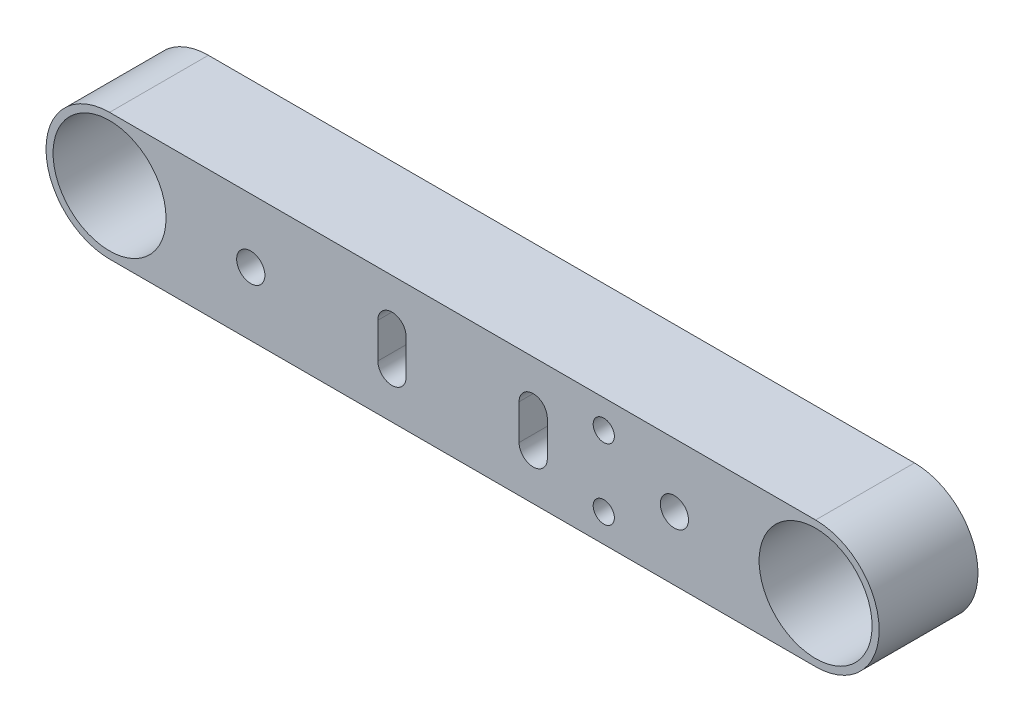
ISO-10303-21;
HEADER;
FILE_DESCRIPTION(('STEP AP214'),'2;1');
FILE_NAME('part.step','',(''),(''),'','','');
FILE_SCHEMA(('AUTOMOTIVE_DESIGN { 1 0 10303 214 1 1 1 1 }'));
ENDSEC;
DATA;
#1=APPLICATION_CONTEXT('core data for automotive mechanical design processes');
#2=APPLICATION_PROTOCOL_DEFINITION('international standard','automotive_design',2000,#1);
#3=PRODUCT_CONTEXT('',#1,'mechanical');
#4=PRODUCT('Part','Part','',(#3));
#5=PRODUCT_RELATED_PRODUCT_CATEGORY('part','',(#4));
#6=PRODUCT_DEFINITION_FORMATION('','',#4);
#7=PRODUCT_DEFINITION_CONTEXT('part definition',#1,'design');
#8=PRODUCT_DEFINITION('design','',#6,#7);
#9=PRODUCT_DEFINITION_SHAPE('','',#8);
#10=(LENGTH_UNIT() NAMED_UNIT(*) SI_UNIT(.MILLI.,.METRE.));
#11=(NAMED_UNIT(*) PLANE_ANGLE_UNIT() SI_UNIT($,.RADIAN.));
#12=(NAMED_UNIT(*) SI_UNIT($,.STERADIAN.) SOLID_ANGLE_UNIT());
#13=UNCERTAINTY_MEASURE_WITH_UNIT(LENGTH_MEASURE(1.E-05),#10,'distance_accuracy_value','');
#14=(GEOMETRIC_REPRESENTATION_CONTEXT(3) GLOBAL_UNCERTAINTY_ASSIGNED_CONTEXT((#13)) GLOBAL_UNIT_ASSIGNED_CONTEXT((#10,
#11,#12)) REPRESENTATION_CONTEXT('',''));
#15=CARTESIAN_POINT('',(0.,0.,0.));
#16=DIRECTION('',(0.,0.,1.));
#17=DIRECTION('',(1.,0.,0.));
#18=AXIS2_PLACEMENT_3D('',#15,#16,#17);
#19=CARTESIAN_POINT('',(-50.,0.,7.));
#20=DIRECTION('',(0.,0.,1.));
#21=DIRECTION('',(1.,0.,0.));
#22=AXIS2_PLACEMENT_3D('',#19,#20,#21);
#23=PLANE('',#22);
#24=DIRECTION('',(0.,1.,0.));
#25=VECTOR('',#24,1.);
#26=CARTESIAN_POINT('',(12.,-2.50000000000001,7.));
#27=LINE('',#26,#25);
#28=CARTESIAN_POINT('',(12.,-2.50000000000001,7.));
#29=VERTEX_POINT('',#28);
#30=CARTESIAN_POINT('',(12.,2.49999999999999,7.));
#31=VERTEX_POINT('',#30);
#32=EDGE_CURVE('E138',#29,#31,#27,.T.);
#33=ORIENTED_EDGE('',*,*,#32,.F.);
#34=CARTESIAN_POINT('',(10.,-2.50000000000001,7.));
#35=DIRECTION('',(0.,0.,1.));
#36=DIRECTION('',(-1.,0.,0.));
#37=AXIS2_PLACEMENT_3D('',#34,#35,#36);
#38=CIRCLE('',#37,2.);
#39=CARTESIAN_POINT('',(8.,-2.50000000000001,7.));
#40=VERTEX_POINT('',#39);
#41=EDGE_CURVE('E130',#40,#29,#38,.T.);
#42=ORIENTED_EDGE('',*,*,#41,.F.);
#43=DIRECTION('',(0.,-1.,0.));
#44=VECTOR('',#43,1.);
#45=CARTESIAN_POINT('',(8.,-2.50000000000001,7.));
#46=LINE('',#45,#44);
#47=CARTESIAN_POINT('',(8.00000000000001,2.49999999999999,7.));
#48=VERTEX_POINT('',#47);
#49=EDGE_CURVE('E153',#48,#40,#46,.T.);
#50=ORIENTED_EDGE('',*,*,#49,.F.);
#51=CARTESIAN_POINT('',(10.,2.49999999999999,7.));
#52=DIRECTION('',(0.,0.,1.));
#53=DIRECTION('',(-1.,0.,0.));
#54=AXIS2_PLACEMENT_3D('',#51,#52,#53);
#55=CIRCLE('',#54,2.);
#56=EDGE_CURVE('E151',#31,#48,#55,.T.);
#57=ORIENTED_EDGE('',*,*,#56,.F.);
#58=EDGE_LOOP('',(#33,#42,#50,#57));
#59=FACE_BOUND('',#58,.T.);
#60=CARTESIAN_POINT('',(20.,5.,7.));
#61=DIRECTION('',(0.,0.,1.));
#62=DIRECTION('',(1.,0.,0.));
#63=AXIS2_PLACEMENT_3D('',#60,#61,#62);
#64=CIRCLE('',#63,1.49999999999998);
#65=CARTESIAN_POINT('',(21.5,5.,7.));
#66=VERTEX_POINT('',#65);
#67=EDGE_CURVE('E169',#66,#66,#64,.T.);
#68=ORIENTED_EDGE('',*,*,#67,.F.);
#69=EDGE_LOOP('',(#68));
#70=FACE_BOUND('',#69,.T.);
#71=CARTESIAN_POINT('',(-50.,0.,7.));
#72=DIRECTION('',(0.,0.,1.));
#73=DIRECTION('',(1.,0.,0.));
#74=AXIS2_PLACEMENT_3D('',#71,#72,#73);
#75=CIRCLE('',#74,7.99999999999997);
#76=CARTESIAN_POINT('',(-42.,0.,7.));
#77=VERTEX_POINT('',#76);
#78=EDGE_CURVE('E212',#77,#77,#75,.T.);
#79=ORIENTED_EDGE('',*,*,#78,.F.);
#80=EDGE_LOOP('',(#79));
#81=FACE_BOUND('',#80,.T.);
#82=CARTESIAN_POINT('',(-30.,0.,7.));
#83=DIRECTION('',(0.,0.,1.));
#84=DIRECTION('',(1.,0.,0.));
#85=AXIS2_PLACEMENT_3D('',#82,#83,#84);
#86=CIRCLE('',#85,2.);
#87=CARTESIAN_POINT('',(-28.,0.,7.));
#88=VERTEX_POINT('',#87);
#89=EDGE_CURVE('E224',#88,#88,#86,.T.);
#90=ORIENTED_EDGE('',*,*,#89,.F.);
#91=EDGE_LOOP('',(#90));
#92=FACE_BOUND('',#91,.T.);
#93=CARTESIAN_POINT('',(-50.,0.,7.));
#94=DIRECTION('',(0.,0.,1.));
#95=DIRECTION('',(1.,0.,0.));
#96=AXIS2_PLACEMENT_3D('',#93,#94,#95);
#97=CIRCLE('',#96,9.);
#98=CARTESIAN_POINT('',(-50.,8.99999999999999,7.));
#99=VERTEX_POINT('',#98);
#100=CARTESIAN_POINT('',(-50.,-9.00000000000001,7.));
#101=VERTEX_POINT('',#100);
#102=EDGE_CURVE('E230',#99,#101,#97,.T.);
#103=ORIENTED_EDGE('',*,*,#102,.T.);
#104=DIRECTION('',(1.,0.,0.));
#105=VECTOR('',#104,1.);
#106=CARTESIAN_POINT('',(-50.,-9.00000000000001,7.));
#107=LINE('',#106,#105);
#108=CARTESIAN_POINT('',(50.,-9.00000000000001,7.));
#109=VERTEX_POINT('',#108);
#110=EDGE_CURVE('E233',#101,#109,#107,.T.);
#111=ORIENTED_EDGE('',*,*,#110,.T.);
#112=CARTESIAN_POINT('',(50.,0.,7.));
#113=DIRECTION('',(0.,0.,1.));
#114=DIRECTION('',(1.,0.,0.));
#115=AXIS2_PLACEMENT_3D('',#112,#113,#114);
#116=CIRCLE('',#115,9.);
#117=CARTESIAN_POINT('',(50.,8.99999999999999,7.));
#118=VERTEX_POINT('',#117);
#119=EDGE_CURVE('E236',#109,#118,#116,.T.);
#120=ORIENTED_EDGE('',*,*,#119,.T.);
#121=DIRECTION('',(-1.,0.,0.));
#122=VECTOR('',#121,1.);
#123=CARTESIAN_POINT('',(-50.,8.99999999999999,7.));
#124=LINE('',#123,#122);
#125=EDGE_CURVE('E238',#118,#99,#124,.T.);
#126=ORIENTED_EDGE('',*,*,#125,.T.);
#127=EDGE_LOOP('',(#103,#111,#120,#126));
#128=FACE_BOUND('',#127,.T.);
#129=CARTESIAN_POINT('',(30.,0.,7.));
#130=DIRECTION('',(0.,0.,1.));
#131=DIRECTION('',(1.,0.,0.));
#132=AXIS2_PLACEMENT_3D('',#129,#130,#131);
#133=CIRCLE('',#132,2.);
#134=CARTESIAN_POINT('',(32.,0.,7.));
#135=VERTEX_POINT('',#134);
#136=EDGE_CURVE('E218',#135,#135,#133,.T.);
#137=ORIENTED_EDGE('',*,*,#136,.F.);
#138=EDGE_LOOP('',(#137));
#139=FACE_BOUND('',#138,.T.);
#140=CARTESIAN_POINT('',(50.,0.,7.));
#141=DIRECTION('',(0.,0.,1.));
#142=DIRECTION('',(1.,0.,0.));
#143=AXIS2_PLACEMENT_3D('',#140,#141,#142);
#144=CIRCLE('',#143,8.);
#145=CARTESIAN_POINT('',(58.,0.,7.));
#146=VERTEX_POINT('',#145);
#147=EDGE_CURVE('E206',#146,#146,#144,.T.);
#148=ORIENTED_EDGE('',*,*,#147,.F.);
#149=EDGE_LOOP('',(#148));
#150=FACE_BOUND('',#149,.T.);
#151=DIRECTION('',(0.,1.,0.));
#152=VECTOR('',#151,1.);
#153=CARTESIAN_POINT('',(-8.00000000000002,-2.50000000000001,7.));
#154=LINE('',#153,#152);
#155=CARTESIAN_POINT('',(-8.00000000000002,-2.50000000000001,7.));
#156=VERTEX_POINT('',#155);
#157=CARTESIAN_POINT('',(-8.00000000000002,2.49999999999999,7.));
#158=VERTEX_POINT('',#157);
#159=EDGE_CURVE('E177',#156,#158,#154,.T.);
#160=ORIENTED_EDGE('',*,*,#159,.F.);
#161=CARTESIAN_POINT('',(-10.,-2.50000000000001,7.));
#162=DIRECTION('',(0.,0.,1.));
#163=DIRECTION('',(1.,0.,0.));
#164=AXIS2_PLACEMENT_3D('',#161,#162,#163);
#165=CIRCLE('',#164,2.);
#166=CARTESIAN_POINT('',(-12.,-2.50000000000001,7.));
#167=VERTEX_POINT('',#166);
#168=EDGE_CURVE('E175',#167,#156,#165,.T.);
#169=ORIENTED_EDGE('',*,*,#168,.F.);
#170=DIRECTION('',(0.,-1.,0.));
#171=VECTOR('',#170,1.);
#172=CARTESIAN_POINT('',(-12.,-2.50000000000001,7.));
#173=LINE('',#172,#171);
#174=CARTESIAN_POINT('',(-12.,2.49999999999999,7.));
#175=VERTEX_POINT('',#174);
#176=EDGE_CURVE('E183',#175,#167,#173,.T.);
#177=ORIENTED_EDGE('',*,*,#176,.F.);
#178=CARTESIAN_POINT('',(-10.,2.49999999999999,7.));
#179=DIRECTION('',(0.,0.,1.));
#180=DIRECTION('',(1.,0.,0.));
#181=AXIS2_PLACEMENT_3D('',#178,#179,#180);
#182=CIRCLE('',#181,2.);
#183=EDGE_CURVE('E180',#158,#175,#182,.T.);
#184=ORIENTED_EDGE('',*,*,#183,.F.);
#185=EDGE_LOOP('',(#160,#169,#177,#184));
#186=FACE_BOUND('',#185,.T.);
#187=CARTESIAN_POINT('',(20.,-5.,7.));
#188=DIRECTION('',(0.,0.,1.));
#189=DIRECTION('',(1.,0.,0.));
#190=AXIS2_PLACEMENT_3D('',#187,#188,#189);
#191=CIRCLE('',#190,1.49999999999997);
#192=CARTESIAN_POINT('',(21.5,-5.,7.));
#193=VERTEX_POINT('',#192);
#194=EDGE_CURVE('E159',#193,#193,#191,.T.);
#195=ORIENTED_EDGE('',*,*,#194,.F.);
#196=EDGE_LOOP('',(#195));
#197=FACE_BOUND('',#196,.T.);
#198=ADVANCED_FACE('F41',(#59,#70,#81,#92,#128,#139,#150,#186,#197),#23,.T.);
#199=CARTESIAN_POINT('',(-50.,0.,-7.));
#200=DIRECTION('',(0.,0.,1.));
#201=DIRECTION('',(1.,0.,0.));
#202=AXIS2_PLACEMENT_3D('',#199,#200,#201);
#203=PLANE('',#202);
#204=CARTESIAN_POINT('',(20.,5.,-7.));
#205=DIRECTION('',(0.,0.,1.));
#206=DIRECTION('',(1.,0.,0.));
#207=AXIS2_PLACEMENT_3D('',#204,#205,#206);
#208=CIRCLE('',#207,1.49999999999998);
#209=CARTESIAN_POINT('',(21.5,5.,-7.));
#210=VERTEX_POINT('',#209);
#211=EDGE_CURVE('E146',#210,#210,#208,.T.);
#212=ORIENTED_EDGE('',*,*,#211,.T.);
#213=EDGE_LOOP('',(#212));
#214=FACE_BOUND('',#213,.T.);
#215=CARTESIAN_POINT('',(-10.,-2.50000000000001,-7.));
#216=DIRECTION('',(0.,0.,1.));
#217=DIRECTION('',(1.,0.,0.));
#218=AXIS2_PLACEMENT_3D('',#215,#216,#217);
#219=CIRCLE('',#218,2.);
#220=CARTESIAN_POINT('',(-12.,-2.50000000000001,-7.));
#221=VERTEX_POINT('',#220);
#222=CARTESIAN_POINT('',(-8.00000000000002,-2.50000000000001,-7.));
#223=VERTEX_POINT('',#222);
#224=EDGE_CURVE('E172',#221,#223,#219,.T.);
#225=ORIENTED_EDGE('',*,*,#224,.T.);
#226=DIRECTION('',(0.,1.,0.));
#227=VECTOR('',#226,1.);
#228=CARTESIAN_POINT('',(-8.00000000000002,-2.50000000000001,-7.));
#229=LINE('',#228,#227);
#230=CARTESIAN_POINT('',(-8.00000000000002,2.49999999999999,-7.));
#231=VERTEX_POINT('',#230);
#232=EDGE_CURVE('E188',#223,#231,#229,.T.);
#233=ORIENTED_EDGE('',*,*,#232,.T.);
#234=CARTESIAN_POINT('',(-10.,2.49999999999999,-7.));
#235=DIRECTION('',(0.,0.,1.));
#236=DIRECTION('',(1.,0.,0.));
#237=AXIS2_PLACEMENT_3D('',#234,#235,#236);
#238=CIRCLE('',#237,2.);
#239=CARTESIAN_POINT('',(-12.,2.49999999999999,-7.));
#240=VERTEX_POINT('',#239);
#241=EDGE_CURVE('E191',#231,#240,#238,.T.);
#242=ORIENTED_EDGE('',*,*,#241,.T.);
#243=DIRECTION('',(0.,-1.,0.));
#244=VECTOR('',#243,1.);
#245=CARTESIAN_POINT('',(-12.,-2.50000000000001,-7.));
#246=LINE('',#245,#244);
#247=EDGE_CURVE('E178',#240,#221,#246,.T.);
#248=ORIENTED_EDGE('',*,*,#247,.T.);
#249=EDGE_LOOP('',(#225,#233,#242,#248));
#250=FACE_BOUND('',#249,.T.);
#251=CARTESIAN_POINT('',(-50.,0.,-7.));
#252=DIRECTION('',(0.,0.,1.));
#253=DIRECTION('',(1.,0.,0.));
#254=AXIS2_PLACEMENT_3D('',#251,#252,#253);
#255=CIRCLE('',#254,9.);
#256=CARTESIAN_POINT('',(-50.,8.99999999999999,-7.));
#257=VERTEX_POINT('',#256);
#258=CARTESIAN_POINT('',(-50.,-9.00000000000001,-7.));
#259=VERTEX_POINT('',#258);
#260=EDGE_CURVE('E227',#257,#259,#255,.T.);
#261=ORIENTED_EDGE('',*,*,#260,.F.);
#262=DIRECTION('',(-1.,0.,0.));
#263=VECTOR('',#262,1.);
#264=CARTESIAN_POINT('',(-50.,8.99999999999999,-7.));
#265=LINE('',#264,#263);
#266=CARTESIAN_POINT('',(50.,8.99999999999999,-7.));
#267=VERTEX_POINT('',#266);
#268=EDGE_CURVE('E234',#267,#257,#265,.T.);
#269=ORIENTED_EDGE('',*,*,#268,.F.);
#270=CARTESIAN_POINT('',(50.,0.,-7.));
#271=DIRECTION('',(0.,0.,1.));
#272=DIRECTION('',(1.,0.,0.));
#273=AXIS2_PLACEMENT_3D('',#270,#271,#272);
#274=CIRCLE('',#273,9.);
#275=CARTESIAN_POINT('',(50.,-9.00000000000001,-7.));
#276=VERTEX_POINT('',#275);
#277=EDGE_CURVE('E245',#276,#267,#274,.T.);
#278=ORIENTED_EDGE('',*,*,#277,.F.);
#279=DIRECTION('',(1.,0.,0.));
#280=VECTOR('',#279,1.);
#281=CARTESIAN_POINT('',(-50.,-9.00000000000001,-7.));
#282=LINE('',#281,#280);
#283=EDGE_CURVE('E243',#259,#276,#282,.T.);
#284=ORIENTED_EDGE('',*,*,#283,.F.);
#285=EDGE_LOOP('',(#261,#269,#278,#284));
#286=FACE_BOUND('',#285,.T.);
#287=CARTESIAN_POINT('',(-30.,0.,-7.));
#288=DIRECTION('',(0.,0.,1.));
#289=DIRECTION('',(1.,0.,0.));
#290=AXIS2_PLACEMENT_3D('',#287,#288,#289);
#291=CIRCLE('',#290,2.);
#292=CARTESIAN_POINT('',(-28.,0.,-7.));
#293=VERTEX_POINT('',#292);
#294=EDGE_CURVE('E221',#293,#293,#291,.T.);
#295=ORIENTED_EDGE('',*,*,#294,.T.);
#296=EDGE_LOOP('',(#295));
#297=FACE_BOUND('',#296,.T.);
#298=CARTESIAN_POINT('',(30.,0.,-7.));
#299=DIRECTION('',(0.,0.,1.));
#300=DIRECTION('',(1.,0.,0.));
#301=AXIS2_PLACEMENT_3D('',#298,#299,#300);
#302=CIRCLE('',#301,2.);
#303=CARTESIAN_POINT('',(32.,0.,-7.));
#304=VERTEX_POINT('',#303);
#305=EDGE_CURVE('E215',#304,#304,#302,.T.);
#306=ORIENTED_EDGE('',*,*,#305,.T.);
#307=EDGE_LOOP('',(#306));
#308=FACE_BOUND('',#307,.T.);
#309=CARTESIAN_POINT('',(-50.,0.,-7.));
#310=DIRECTION('',(0.,0.,1.));
#311=DIRECTION('',(1.,0.,0.));
#312=AXIS2_PLACEMENT_3D('',#309,#310,#311);
#313=CIRCLE('',#312,7.99999999999997);
#314=CARTESIAN_POINT('',(-42.,0.,-7.));
#315=VERTEX_POINT('',#314);
#316=EDGE_CURVE('E209',#315,#315,#313,.T.);
#317=ORIENTED_EDGE('',*,*,#316,.T.);
#318=EDGE_LOOP('',(#317));
#319=FACE_BOUND('',#318,.T.);
#320=CARTESIAN_POINT('',(50.,0.,-7.));
#321=DIRECTION('',(0.,0.,1.));
#322=DIRECTION('',(1.,0.,0.));
#323=AXIS2_PLACEMENT_3D('',#320,#321,#322);
#324=CIRCLE('',#323,8.);
#325=CARTESIAN_POINT('',(58.,0.,-7.));
#326=VERTEX_POINT('',#325);
#327=EDGE_CURVE('E205',#326,#326,#324,.T.);
#328=ORIENTED_EDGE('',*,*,#327,.T.);
#329=EDGE_LOOP('',(#328));
#330=FACE_BOUND('',#329,.T.);
#331=CARTESIAN_POINT('',(10.,-2.50000000000001,-7.));
#332=DIRECTION('',(0.,0.,1.));
#333=DIRECTION('',(-1.,0.,0.));
#334=AXIS2_PLACEMENT_3D('',#331,#332,#333);
#335=CIRCLE('',#334,2.);
#336=CARTESIAN_POINT('',(8.00000000000001,-2.50000000000001,-7.));
#337=VERTEX_POINT('',#336);
#338=CARTESIAN_POINT('',(12.,-2.50000000000001,-7.));
#339=VERTEX_POINT('',#338);
#340=EDGE_CURVE('E64',#337,#339,#335,.T.);
#341=ORIENTED_EDGE('',*,*,#340,.T.);
#342=DIRECTION('',(0.,1.,0.));
#343=VECTOR('',#342,1.);
#344=CARTESIAN_POINT('',(12.,-2.50000000000001,-7.));
#345=LINE('',#344,#343);
#346=CARTESIAN_POINT('',(12.,2.49999999999999,-7.));
#347=VERTEX_POINT('',#346);
#348=EDGE_CURVE('E145',#339,#347,#345,.T.);
#349=ORIENTED_EDGE('',*,*,#348,.T.);
#350=CARTESIAN_POINT('',(10.,2.49999999999999,-7.));
#351=DIRECTION('',(0.,0.,1.));
#352=DIRECTION('',(-1.,0.,0.));
#353=AXIS2_PLACEMENT_3D('',#350,#351,#352);
#354=CIRCLE('',#353,2.);
#355=CARTESIAN_POINT('',(8.,2.49999999999999,-7.));
#356=VERTEX_POINT('',#355);
#357=EDGE_CURVE('E161',#347,#356,#354,.T.);
#358=ORIENTED_EDGE('',*,*,#357,.T.);
#359=DIRECTION('',(0.,-1.,0.));
#360=VECTOR('',#359,1.);
#361=CARTESIAN_POINT('',(8.,-2.50000000000001,-7.));
#362=LINE('',#361,#360);
#363=EDGE_CURVE('E139',#356,#337,#362,.T.);
#364=ORIENTED_EDGE('',*,*,#363,.T.);
#365=EDGE_LOOP('',(#341,#349,#358,#364));
#366=FACE_BOUND('',#365,.T.);
#367=CARTESIAN_POINT('',(20.,-5.,-7.));
#368=DIRECTION('',(0.,0.,1.));
#369=DIRECTION('',(1.,0.,0.));
#370=AXIS2_PLACEMENT_3D('',#367,#368,#369);
#371=CIRCLE('',#370,1.49999999999997);
#372=CARTESIAN_POINT('',(21.5,-5.,-7.));
#373=VERTEX_POINT('',#372);
#374=EDGE_CURVE('E316',#373,#373,#371,.T.);
#375=ORIENTED_EDGE('',*,*,#374,.T.);
#376=EDGE_LOOP('',(#375));
#377=FACE_BOUND('',#376,.T.);
#378=ADVANCED_FACE('F263',(#214,#250,#286,#297,#308,#319,#330,#366,#377),#203,.F.);
#379=CARTESIAN_POINT('',(-50.,0.,7.));
#380=DIRECTION('',(0.,0.,-1.));
#381=DIRECTION('',(-1.,0.,0.));
#382=AXIS2_PLACEMENT_3D('',#379,#380,#381);
#383=CYLINDRICAL_SURFACE('',#382,9.);
#384=ORIENTED_EDGE('',*,*,#260,.T.);
#385=DIRECTION('',(0.,0.,-1.));
#386=VECTOR('',#385,1.);
#387=CARTESIAN_POINT('',(-50.,-9.00000000000001,7.));
#388=LINE('',#387,#386);
#389=EDGE_CURVE('E11',#101,#259,#388,.T.);
#390=ORIENTED_EDGE('',*,*,#389,.F.);
#391=ORIENTED_EDGE('',*,*,#102,.F.);
#392=DIRECTION('',(0.,0.,-1.));
#393=VECTOR('',#392,1.);
#394=CARTESIAN_POINT('',(-50.,8.99999999999999,7.));
#395=LINE('',#394,#393);
#396=EDGE_CURVE('E240',#99,#257,#395,.T.);
#397=ORIENTED_EDGE('',*,*,#396,.T.);
#398=EDGE_LOOP('',(#384,#390,#391,#397));
#399=FACE_BOUND('',#398,.T.);
#400=ADVANCED_FACE('F43',(#399),#383,.T.);
#401=CARTESIAN_POINT('',(-50.,-9.00000000000001,7.));
#402=DIRECTION('',(0.,1.,0.));
#403=DIRECTION('',(0.,0.,1.));
#404=AXIS2_PLACEMENT_3D('',#401,#402,#403);
#405=PLANE('',#404);
#406=ORIENTED_EDGE('',*,*,#283,.T.);
#407=DIRECTION('',(0.,0.,-1.));
#408=VECTOR('',#407,1.);
#409=CARTESIAN_POINT('',(50.,-9.00000000000001,7.));
#410=LINE('',#409,#408);
#411=EDGE_CURVE('E49',#109,#276,#410,.T.);
#412=ORIENTED_EDGE('',*,*,#411,.F.);
#413=ORIENTED_EDGE('',*,*,#110,.F.);
#414=ORIENTED_EDGE('',*,*,#389,.T.);
#415=EDGE_LOOP('',(#406,#412,#413,#414));
#416=FACE_BOUND('',#415,.T.);
#417=ADVANCED_FACE('F274',(#416),#405,.F.);
#418=CARTESIAN_POINT('',(50.,0.,7.));
#419=DIRECTION('',(0.,0.,-1.));
#420=DIRECTION('',(-1.,0.,0.));
#421=AXIS2_PLACEMENT_3D('',#418,#419,#420);
#422=CYLINDRICAL_SURFACE('',#421,9.);
#423=ORIENTED_EDGE('',*,*,#277,.T.);
#424=DIRECTION('',(0.,0.,-1.));
#425=VECTOR('',#424,1.);
#426=CARTESIAN_POINT('',(50.,8.99999999999999,7.));
#427=LINE('',#426,#425);
#428=EDGE_CURVE('E250',#118,#267,#427,.T.);
#429=ORIENTED_EDGE('',*,*,#428,.F.);
#430=ORIENTED_EDGE('',*,*,#119,.F.);
#431=ORIENTED_EDGE('',*,*,#411,.T.);
#432=EDGE_LOOP('',(#423,#429,#430,#431));
#433=FACE_BOUND('',#432,.T.);
#434=ADVANCED_FACE('F257',(#433),#422,.T.);
#435=CARTESIAN_POINT('',(-50.,8.99999999999999,7.));
#436=DIRECTION('',(0.,-1.,0.));
#437=DIRECTION('',(0.,0.,-1.));
#438=AXIS2_PLACEMENT_3D('',#435,#436,#437);
#439=PLANE('',#438);
#440=ORIENTED_EDGE('',*,*,#268,.T.);
#441=ORIENTED_EDGE('',*,*,#396,.F.);
#442=ORIENTED_EDGE('',*,*,#125,.F.);
#443=ORIENTED_EDGE('',*,*,#428,.T.);
#444=EDGE_LOOP('',(#440,#441,#442,#443));
#445=FACE_BOUND('',#444,.T.);
#446=ADVANCED_FACE('F267',(#445),#439,.F.);
#447=CARTESIAN_POINT('',(-30.,0.,7.));
#448=DIRECTION('',(0.,0.,-1.));
#449=DIRECTION('',(-1.,0.,0.));
#450=AXIS2_PLACEMENT_3D('',#447,#448,#449);
#451=CYLINDRICAL_SURFACE('',#450,2.);
#452=ORIENTED_EDGE('',*,*,#89,.T.);
#453=EDGE_LOOP('',(#452));
#454=FACE_BOUND('',#453,.T.);
#455=ORIENTED_EDGE('',*,*,#294,.F.);
#456=EDGE_LOOP('',(#455));
#457=FACE_BOUND('',#456,.T.);
#458=ADVANCED_FACE('F289',(#454,#457),#451,.F.);
#459=CARTESIAN_POINT('',(30.,0.,7.));
#460=DIRECTION('',(0.,0.,-1.));
#461=DIRECTION('',(-1.,0.,0.));
#462=AXIS2_PLACEMENT_3D('',#459,#460,#461);
#463=CYLINDRICAL_SURFACE('',#462,2.);
#464=ORIENTED_EDGE('',*,*,#136,.T.);
#465=EDGE_LOOP('',(#464));
#466=FACE_BOUND('',#465,.T.);
#467=ORIENTED_EDGE('',*,*,#305,.F.);
#468=EDGE_LOOP('',(#467));
#469=FACE_BOUND('',#468,.T.);
#470=ADVANCED_FACE('F296',(#466,#469),#463,.F.);
#471=CARTESIAN_POINT('',(-50.,0.,7.));
#472=DIRECTION('',(0.,0.,-1.));
#473=DIRECTION('',(-1.,0.,0.));
#474=AXIS2_PLACEMENT_3D('',#471,#472,#473);
#475=CYLINDRICAL_SURFACE('',#474,7.99999999999997);
#476=ORIENTED_EDGE('',*,*,#78,.T.);
#477=EDGE_LOOP('',(#476));
#478=FACE_BOUND('',#477,.T.);
#479=ORIENTED_EDGE('',*,*,#316,.F.);
#480=EDGE_LOOP('',(#479));
#481=FACE_BOUND('',#480,.T.);
#482=ADVANCED_FACE('F301',(#478,#481),#475,.F.);
#483=CARTESIAN_POINT('',(50.,0.,7.));
#484=DIRECTION('',(0.,0.,-1.));
#485=DIRECTION('',(-1.,0.,0.));
#486=AXIS2_PLACEMENT_3D('',#483,#484,#485);
#487=CYLINDRICAL_SURFACE('',#486,8.);
#488=ORIENTED_EDGE('',*,*,#147,.T.);
#489=EDGE_LOOP('',(#488));
#490=FACE_BOUND('',#489,.T.);
#491=ORIENTED_EDGE('',*,*,#327,.F.);
#492=EDGE_LOOP('',(#491));
#493=FACE_BOUND('',#492,.T.);
#494=ADVANCED_FACE('F359',(#490,#493),#487,.F.);
#495=CARTESIAN_POINT('',(-10.,-2.50000000000001,7.));
#496=DIRECTION('',(0.,0.,-1.));
#497=DIRECTION('',(-1.,0.,0.));
#498=AXIS2_PLACEMENT_3D('',#495,#496,#497);
#499=CYLINDRICAL_SURFACE('',#498,2.);
#500=ORIENTED_EDGE('',*,*,#224,.F.);
#501=DIRECTION('',(0.,0.,-1.));
#502=VECTOR('',#501,1.);
#503=CARTESIAN_POINT('',(-12.,-2.50000000000001,7.));
#504=LINE('',#503,#502);
#505=EDGE_CURVE('E185',#167,#221,#504,.T.);
#506=ORIENTED_EDGE('',*,*,#505,.F.);
#507=ORIENTED_EDGE('',*,*,#168,.T.);
#508=DIRECTION('',(0.,0.,-1.));
#509=VECTOR('',#508,1.);
#510=CARTESIAN_POINT('',(-8.00000000000002,-2.50000000000001,7.));
#511=LINE('',#510,#509);
#512=EDGE_CURVE('E202',#156,#223,#511,.T.);
#513=ORIENTED_EDGE('',*,*,#512,.T.);
#514=EDGE_LOOP('',(#500,#506,#507,#513));
#515=FACE_BOUND('',#514,.T.);
#516=ADVANCED_FACE('F355',(#515),#499,.F.);
#517=CARTESIAN_POINT('',(-8.00000000000002,-2.50000000000001,7.));
#518=DIRECTION('',(-1.,0.,0.));
#519=DIRECTION('',(0.,0.,1.));
#520=AXIS2_PLACEMENT_3D('',#517,#518,#519);
#521=PLANE('',#520);
#522=ORIENTED_EDGE('',*,*,#232,.F.);
#523=ORIENTED_EDGE('',*,*,#512,.F.);
#524=ORIENTED_EDGE('',*,*,#159,.T.);
#525=DIRECTION('',(0.,0.,-1.));
#526=VECTOR('',#525,1.);
#527=CARTESIAN_POINT('',(-8.00000000000002,2.49999999999999,7.));
#528=LINE('',#527,#526);
#529=EDGE_CURVE('E200',#158,#231,#528,.T.);
#530=ORIENTED_EDGE('',*,*,#529,.T.);
#531=EDGE_LOOP('',(#522,#523,#524,#530));
#532=FACE_BOUND('',#531,.T.);
#533=ADVANCED_FACE('F351',(#532),#521,.T.);
#534=CARTESIAN_POINT('',(-10.,2.49999999999999,7.));
#535=DIRECTION('',(0.,0.,-1.));
#536=DIRECTION('',(-1.,0.,0.));
#537=AXIS2_PLACEMENT_3D('',#534,#535,#536);
#538=CYLINDRICAL_SURFACE('',#537,2.);
#539=ORIENTED_EDGE('',*,*,#241,.F.);
#540=ORIENTED_EDGE('',*,*,#529,.F.);
#541=ORIENTED_EDGE('',*,*,#183,.T.);
#542=DIRECTION('',(0.,0.,-1.));
#543=VECTOR('',#542,1.);
#544=CARTESIAN_POINT('',(-12.,2.49999999999999,7.));
#545=LINE('',#544,#543);
#546=EDGE_CURVE('E198',#175,#240,#545,.T.);
#547=ORIENTED_EDGE('',*,*,#546,.T.);
#548=EDGE_LOOP('',(#539,#540,#541,#547));
#549=FACE_BOUND('',#548,.T.);
#550=ADVANCED_FACE('F347',(#549),#538,.F.);
#551=CARTESIAN_POINT('',(-12.,-2.50000000000001,7.));
#552=DIRECTION('',(1.,0.,0.));
#553=DIRECTION('',(0.,0.,-1.));
#554=AXIS2_PLACEMENT_3D('',#551,#552,#553);
#555=PLANE('',#554);
#556=ORIENTED_EDGE('',*,*,#247,.F.);
#557=ORIENTED_EDGE('',*,*,#546,.F.);
#558=ORIENTED_EDGE('',*,*,#176,.T.);
#559=ORIENTED_EDGE('',*,*,#505,.T.);
#560=EDGE_LOOP('',(#556,#557,#558,#559));
#561=FACE_BOUND('',#560,.T.);
#562=ADVANCED_FACE('F343',(#561),#555,.T.);
#563=CARTESIAN_POINT('',(20.,5.,7.));
#564=DIRECTION('',(0.,0.,-1.));
#565=DIRECTION('',(-1.,0.,0.));
#566=AXIS2_PLACEMENT_3D('',#563,#564,#565);
#567=CYLINDRICAL_SURFACE('',#566,1.49999999999998);
#568=ORIENTED_EDGE('',*,*,#67,.T.);
#569=EDGE_LOOP('',(#568));
#570=FACE_BOUND('',#569,.T.);
#571=ORIENTED_EDGE('',*,*,#211,.F.);
#572=EDGE_LOOP('',(#571));
#573=FACE_BOUND('',#572,.T.);
#574=ADVANCED_FACE('F340',(#570,#573),#567,.F.);
#575=CARTESIAN_POINT('',(10.,-2.50000000000001,7.));
#576=DIRECTION('',(0.,0.,-1.));
#577=DIRECTION('',(-1.,0.,0.));
#578=AXIS2_PLACEMENT_3D('',#575,#576,#577);
#579=CYLINDRICAL_SURFACE('',#578,2.);
#580=ORIENTED_EDGE('',*,*,#340,.F.);
#581=DIRECTION('',(0.,0.,-1.));
#582=VECTOR('',#581,1.);
#583=CARTESIAN_POINT('',(8.,-2.50000000000001,7.));
#584=LINE('',#583,#582);
#585=EDGE_CURVE('E134',#40,#337,#584,.T.);
#586=ORIENTED_EDGE('',*,*,#585,.F.);
#587=ORIENTED_EDGE('',*,*,#41,.T.);
#588=DIRECTION('',(0.,0.,-1.));
#589=VECTOR('',#588,1.);
#590=CARTESIAN_POINT('',(12.,-2.50000000000001,7.));
#591=LINE('',#590,#589);
#592=EDGE_CURVE('E133',#29,#339,#591,.T.);
#593=ORIENTED_EDGE('',*,*,#592,.T.);
#594=EDGE_LOOP('',(#580,#586,#587,#593));
#595=FACE_BOUND('',#594,.T.);
#596=ADVANCED_FACE('F132',(#595),#579,.F.);
#597=CARTESIAN_POINT('',(12.,-2.50000000000001,7.));
#598=DIRECTION('',(-1.,0.,0.));
#599=DIRECTION('',(0.,0.,1.));
#600=AXIS2_PLACEMENT_3D('',#597,#598,#599);
#601=PLANE('',#600);
#602=ORIENTED_EDGE('',*,*,#348,.F.);
#603=ORIENTED_EDGE('',*,*,#592,.F.);
#604=ORIENTED_EDGE('',*,*,#32,.T.);
#605=DIRECTION('',(0.,0.,-1.));
#606=VECTOR('',#605,1.);
#607=CARTESIAN_POINT('',(12.,2.49999999999999,7.));
#608=LINE('',#607,#606);
#609=EDGE_CURVE('E147',#31,#347,#608,.T.);
#610=ORIENTED_EDGE('',*,*,#609,.T.);
#611=EDGE_LOOP('',(#602,#603,#604,#610));
#612=FACE_BOUND('',#611,.T.);
#613=ADVANCED_FACE('F142',(#612),#601,.T.);
#614=CARTESIAN_POINT('',(10.,2.49999999999999,7.));
#615=DIRECTION('',(0.,0.,-1.));
#616=DIRECTION('',(-1.,0.,0.));
#617=AXIS2_PLACEMENT_3D('',#614,#615,#616);
#618=CYLINDRICAL_SURFACE('',#617,2.);
#619=ORIENTED_EDGE('',*,*,#357,.F.);
#620=ORIENTED_EDGE('',*,*,#609,.F.);
#621=ORIENTED_EDGE('',*,*,#56,.T.);
#622=DIRECTION('',(0.,0.,-1.));
#623=VECTOR('',#622,1.);
#624=CARTESIAN_POINT('',(8.,2.49999999999999,7.));
#625=LINE('',#624,#623);
#626=EDGE_CURVE('E56',#48,#356,#625,.T.);
#627=ORIENTED_EDGE('',*,*,#626,.T.);
#628=EDGE_LOOP('',(#619,#620,#621,#627));
#629=FACE_BOUND('',#628,.T.);
#630=ADVANCED_FACE('F330',(#629),#618,.F.);
#631=CARTESIAN_POINT('',(8.,-2.50000000000001,7.));
#632=DIRECTION('',(1.,0.,0.));
#633=DIRECTION('',(0.,0.,-1.));
#634=AXIS2_PLACEMENT_3D('',#631,#632,#633);
#635=PLANE('',#634);
#636=ORIENTED_EDGE('',*,*,#363,.F.);
#637=ORIENTED_EDGE('',*,*,#626,.F.);
#638=ORIENTED_EDGE('',*,*,#49,.T.);
#639=ORIENTED_EDGE('',*,*,#585,.T.);
#640=EDGE_LOOP('',(#636,#637,#638,#639));
#641=FACE_BOUND('',#640,.T.);
#642=ADVANCED_FACE('F325',(#641),#635,.T.);
#643=CARTESIAN_POINT('',(20.,-5.,7.));
#644=DIRECTION('',(0.,0.,-1.));
#645=DIRECTION('',(-1.,0.,0.));
#646=AXIS2_PLACEMENT_3D('',#643,#644,#645);
#647=CYLINDRICAL_SURFACE('',#646,1.49999999999997);
#648=ORIENTED_EDGE('',*,*,#194,.T.);
#649=EDGE_LOOP('',(#648));
#650=FACE_BOUND('',#649,.T.);
#651=ORIENTED_EDGE('',*,*,#374,.F.);
#652=EDGE_LOOP('',(#651));
#653=FACE_BOUND('',#652,.T.);
#654=ADVANCED_FACE('F322',(#650,#653),#647,.F.);
#655=CLOSED_SHELL('',(#198,#378,#400,#417,#434,#446,#458,#470,#482,#494,#516,#533,#550,#562,
#574,#596,#613,#630,#642,#654));
#656=MANIFOLD_SOLID_BREP('B2',#655);
#657=ADVANCED_BREP_SHAPE_REPRESENTATION('',(#18,#656),#14);
#658=SHAPE_DEFINITION_REPRESENTATION(#9,#657);
ENDSEC;
END-ISO-10303-21;
